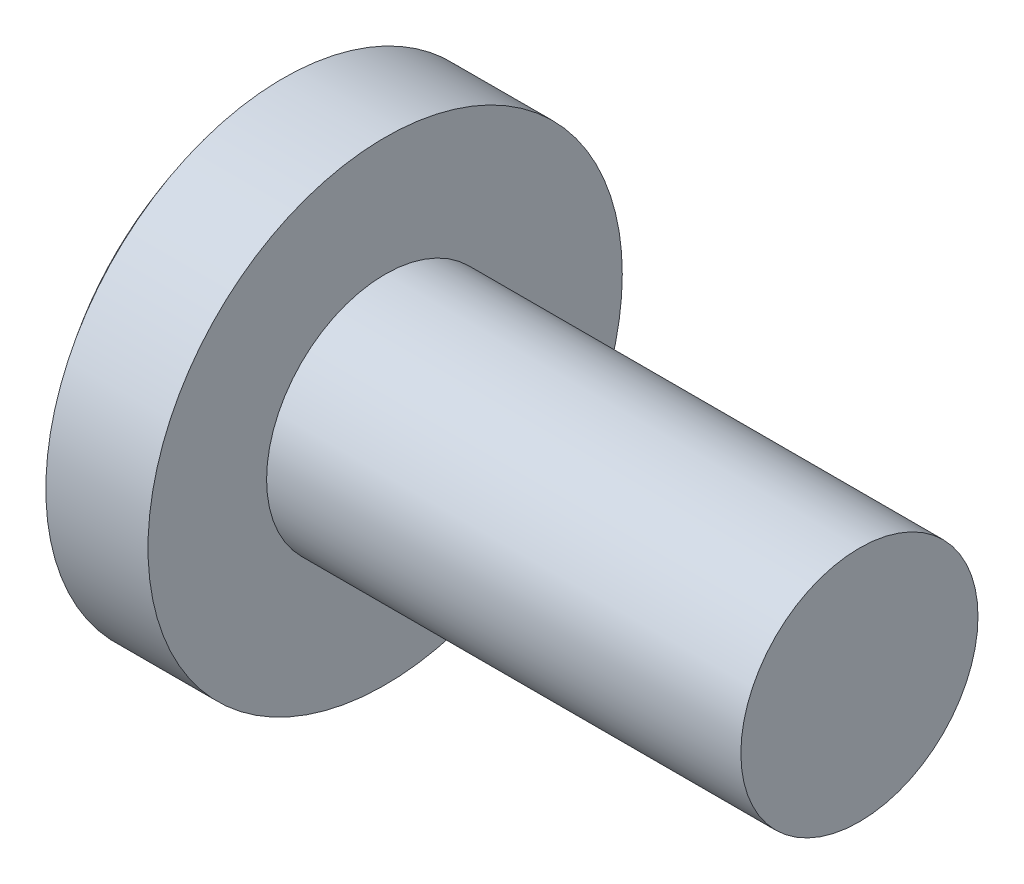
ISO-10303-21;
HEADER;
FILE_DESCRIPTION(('STEP AP214'),'2;1');
FILE_NAME('part.step','',(''),(''),'','','');
FILE_SCHEMA(('AUTOMOTIVE_DESIGN { 1 0 10303 214 1 1 1 1 }'));
ENDSEC;
DATA;
#1=APPLICATION_CONTEXT('core data for automotive mechanical design processes');
#2=APPLICATION_PROTOCOL_DEFINITION('international standard','automotive_design',2000,#1);
#3=PRODUCT_CONTEXT('',#1,'mechanical');
#4=PRODUCT('Part','Part','',(#3));
#5=PRODUCT_RELATED_PRODUCT_CATEGORY('part','',(#4));
#6=PRODUCT_DEFINITION_FORMATION('','',#4);
#7=PRODUCT_DEFINITION_CONTEXT('part definition',#1,'design');
#8=PRODUCT_DEFINITION('design','',#6,#7);
#9=PRODUCT_DEFINITION_SHAPE('','',#8);
#10=(LENGTH_UNIT() NAMED_UNIT(*) SI_UNIT(.MILLI.,.METRE.));
#11=(NAMED_UNIT(*) PLANE_ANGLE_UNIT() SI_UNIT($,.RADIAN.));
#12=(NAMED_UNIT(*) SI_UNIT($,.STERADIAN.) SOLID_ANGLE_UNIT());
#13=UNCERTAINTY_MEASURE_WITH_UNIT(LENGTH_MEASURE(1.E-05),#10,'distance_accuracy_value','');
#14=(GEOMETRIC_REPRESENTATION_CONTEXT(3) GLOBAL_UNCERTAINTY_ASSIGNED_CONTEXT((#13)) GLOBAL_UNIT_ASSIGNED_CONTEXT((#10,
#11,#12)) REPRESENTATION_CONTEXT('',''));
#15=CARTESIAN_POINT('',(0.,0.,0.));
#16=DIRECTION('',(0.,0.,1.));
#17=DIRECTION('',(1.,0.,0.));
#18=AXIS2_PLACEMENT_3D('',#15,#16,#17);
#19=CARTESIAN_POINT('',(6.5,0.,0.));
#20=DIRECTION('',(1.,0.,0.));
#21=DIRECTION('',(0.,1.,0.));
#22=AXIS2_PLACEMENT_3D('',#19,#20,#21);
#23=SPHERICAL_SURFACE('',#22,6.5);
#24=CARTESIAN_POINT('',(1.3765246170202,0.,0.));
#25=DIRECTION('',(1.,0.,0.));
#26=DIRECTION('',(0.,0.,-1.));
#27=AXIS2_PLACEMENT_3D('',#24,#25,#26);
#28=CIRCLE('',#27,4.);
#29=CARTESIAN_POINT('',(1.3765246170202,0.,-4.));
#30=VERTEX_POINT('',#29);
#31=EDGE_CURVE('E154',#30,#30,#28,.T.);
#32=ORIENTED_EDGE('',*,*,#31,.F.);
#33=EDGE_LOOP('',(#32));
#34=FACE_BOUND('',#33,.T.);
#35=CARTESIAN_POINT('',(6.5,-0.44,0.));
#36=DIRECTION('',(0.,1.,0.));
#37=DIRECTION('',(0.,0.,1.));
#38=AXIS2_PLACEMENT_3D('',#35,#36,#37);
#39=CIRCLE('',#38,6.48509059304494);
#40=CARTESIAN_POINT('',(0.333444887912562,-0.440000000000001,2.00748550420378));
#41=VERTEX_POINT('',#40);
#42=CARTESIAN_POINT('',(0.0572676603788668,-0.44,0.74));
#43=VERTEX_POINT('',#42);
#44=EDGE_CURVE('E237',#41,#43,#39,.F.);
#45=ORIENTED_EDGE('',*,*,#44,.T.);
#46=CARTESIAN_POINT('',(0.0572676603788668,-0.44,0.74));
#47=CARTESIAN_POINT('',(0.0553459095034013,-0.439985341253235,0.72328305296714));
#48=CARTESIAN_POINT('',(0.0535867486844832,-0.441396550947806,0.706548480277779));
#49=CARTESIAN_POINT('',(0.0504373840847339,-0.446984059228203,0.673519044256814));
#50=CARTESIAN_POINT('',(0.049047023684214,-0.451159181412456,0.657223996920084));
#51=CARTESIAN_POINT('',(0.0466764207612451,-0.462192225889046,0.625521412589929));
#52=CARTESIAN_POINT('',(0.045696493338291,-0.469052201622536,0.610114565285908));
#53=CARTESIAN_POINT('',(0.0441774835674306,-0.485262357640217,0.580654009149765));
#54=CARTESIAN_POINT('',(0.043638262994652,-0.494611755912349,0.566599877268183));
#55=CARTESIAN_POINT('',(0.0430188919704421,-0.515464220625998,0.540343256526173));
#56=CARTESIAN_POINT('',(0.0429355253534806,-0.526951606000225,0.528128388224687));
#57=CARTESIAN_POINT('',(0.0432217527040635,-0.551797332001338,0.505780157883181));
#58=CARTESIAN_POINT('',(0.0435914161120769,-0.565155959174266,0.49564711522353));
#59=CARTESIAN_POINT('',(0.0447707140747327,-0.593313108529131,0.477778249110346));
#60=CARTESIAN_POINT('',(0.0455789968290601,-0.608107092571906,0.470035174343328));
#61=CARTESIAN_POINT('',(0.0476108904953491,-0.638747141176103,0.457114889529338));
#62=CARTESIAN_POINT('',(0.0488343419884246,-0.65459280003348,0.451936696478722));
#63=CARTESIAN_POINT('',(0.0512407906304824,-0.682094193797786,0.445409618854467));
#64=CARTESIAN_POINT('',(0.0523285977729336,-0.693602036355864,0.443380984422657));
#65=CARTESIAN_POINT('',(0.0546743160010162,-0.716741634082106,0.440676069271593));
#66=CARTESIAN_POINT('',(0.0559319812556667,-0.728373188198784,0.439997856052776));
#67=CARTESIAN_POINT('',(0.057267660378867,-0.74,0.44));
#68=B_SPLINE_CURVE_WITH_KNOTS('',3,(#46,#47,#48,#49,#50,#51,#52,#53,#54,#55,#56,#57,#58,#59,#60,
#61,#62,#63,#64,#65,#66,#67),.UNSPECIFIED.,.F.,.F.,(4,2,2,2,2,2,2,2,2,2,4),(0.,
0.0504198812115462,0.100818316040611,0.151255372379012,0.201676603381452,0.251741636319805,
0.301814344189272,0.351733600037098,0.401633709250622,0.436765534122532,0.471847047898825),.UNSPECIFIED.);
#69=CARTESIAN_POINT('',(0.0572676603788668,-0.74,0.44));
#70=VERTEX_POINT('',#69);
#71=EDGE_CURVE('E240',#43,#70,#68,.T.);
#72=ORIENTED_EDGE('',*,*,#71,.T.);
#73=CARTESIAN_POINT('',(6.5,0.,0.44));
#74=DIRECTION('',(0.,0.,-1.));
#75=DIRECTION('',(0.,1.,0.));
#76=AXIS2_PLACEMENT_3D('',#73,#74,#75);
#77=CIRCLE('',#76,6.48509059304494);
#78=CARTESIAN_POINT('',(0.333444887912563,-2.00748550420378,0.439999999999999));
#79=VERTEX_POINT('',#78);
#80=EDGE_CURVE('E248',#70,#79,#77,.F.);
#81=ORIENTED_EDGE('',*,*,#80,.T.);
#82=CARTESIAN_POINT('',(5.82762794416288,1.16458256229943,0.));
#83=DIRECTION('',(-0.500000000000001,0.866025403784438,0.));
#84=DIRECTION('',(-0.866025403784438,-0.500000000000001,0.));
#85=AXIS2_PLACEMENT_3D('',#82,#83,#84);
#86=CIRCLE('',#85,6.35937601295264);
#87=CARTESIAN_POINT('',(0.333444887912563,-2.00748550420378,-0.44));
#88=VERTEX_POINT('',#87);
#89=EDGE_CURVE('E251',#79,#88,#86,.F.);
#90=ORIENTED_EDGE('',*,*,#89,.T.);
#91=CARTESIAN_POINT('',(6.5,0.,-0.44));
#92=DIRECTION('',(0.,0.,1.));
#93=DIRECTION('',(0.,-1.,0.));
#94=AXIS2_PLACEMENT_3D('',#91,#92,#93);
#95=CIRCLE('',#94,6.48509059304494);
#96=CARTESIAN_POINT('',(0.0572676603788668,-0.74,-0.44));
#97=VERTEX_POINT('',#96);
#98=EDGE_CURVE('E258',#88,#97,#95,.F.);
#99=ORIENTED_EDGE('',*,*,#98,.T.);
#100=CARTESIAN_POINT('',(0.0572676603788668,-0.74,-0.44));
#101=CARTESIAN_POINT('',(0.0553459095034004,-0.72328305296714,-0.439985341253235));
#102=CARTESIAN_POINT('',(0.0535867486844825,-0.706548480277779,-0.441396550947806));
#103=CARTESIAN_POINT('',(0.0504373840847338,-0.673519044256814,-0.446984059228203));
#104=CARTESIAN_POINT('',(0.0490470236842143,-0.657223996920084,-0.451159181412456));
#105=CARTESIAN_POINT('',(0.0466764207612448,-0.625521412589929,-0.462192225889046));
#106=CARTESIAN_POINT('',(0.0456964933382896,-0.610114565285909,-0.469052201622536));
#107=CARTESIAN_POINT('',(0.0441774835674296,-0.580654009149766,-0.485262357640217));
#108=CARTESIAN_POINT('',(0.0436382629946526,-0.566599877268183,-0.49461175591235));
#109=CARTESIAN_POINT('',(0.0430188919704431,-0.540343256526173,-0.515464220625998));
#110=CARTESIAN_POINT('',(0.0429355253534805,-0.528128388224687,-0.526951606000225));
#111=CARTESIAN_POINT('',(0.0432217527040627,-0.505780157883181,-0.551797332001338));
#112=CARTESIAN_POINT('',(0.0435914161120766,-0.49564711522353,-0.565155959174266));
#113=CARTESIAN_POINT('',(0.0447707140747329,-0.477778249110346,-0.593313108529131));
#114=CARTESIAN_POINT('',(0.0455789968290602,-0.470035174343328,-0.608107092571906));
#115=CARTESIAN_POINT('',(0.0476108904953489,-0.457114889529338,-0.638747141176103));
#116=CARTESIAN_POINT('',(0.0488343419884243,-0.451936696478722,-0.65459280003348));
#117=CARTESIAN_POINT('',(0.0512407906304825,-0.445409618854467,-0.682094193797787));
#118=CARTESIAN_POINT('',(0.0523285977729342,-0.443380984422657,-0.693602036355865));
#119=CARTESIAN_POINT('',(0.0546743160010168,-0.440676069271593,-0.716741634082106));
#120=CARTESIAN_POINT('',(0.055931981255667,-0.439997856052776,-0.728373188198785));
#121=CARTESIAN_POINT('',(0.057267660378866,-0.44,-0.74));
#122=B_SPLINE_CURVE_WITH_KNOTS('',3,(#100,#101,#102,#103,#104,#105,#106,#107,#108,#109,#110,
#111,#112,#113,#114,#115,#116,#117,#118,#119,#120,#121),.UNSPECIFIED.,.F.,.F.,(4,2,2,2,2,2,2,2,
2,2,4),(0.,0.0504198812115463,0.100818316040611,0.151255372379012,0.201676603381452,
0.251741636319806,0.301814344189272,0.351733600037098,0.401633709250623,0.436765534122532,
0.471847047898826),.UNSPECIFIED.);
#123=CARTESIAN_POINT('',(0.0572676603788668,-0.44,-0.74));
#124=VERTEX_POINT('',#123);
#125=EDGE_CURVE('E295',#97,#124,#122,.T.);
#126=ORIENTED_EDGE('',*,*,#125,.T.);
#127=CARTESIAN_POINT('',(6.5,-0.44,0.));
#128=DIRECTION('',(0.,1.,0.));
#129=DIRECTION('',(0.,0.,1.));
#130=AXIS2_PLACEMENT_3D('',#127,#128,#129);
#131=CIRCLE('',#130,6.48509059304494);
#132=CARTESIAN_POINT('',(0.333444887912563,-0.44,-2.00748550420378));
#133=VERTEX_POINT('',#132);
#134=EDGE_CURVE('E256',#124,#133,#131,.F.);
#135=ORIENTED_EDGE('',*,*,#134,.T.);
#136=CARTESIAN_POINT('',(5.82762794416288,0.,1.16458256229943));
#137=DIRECTION('',(-0.500000000000001,0.,0.866025403784438));
#138=DIRECTION('',(0.866025403784438,0.,0.500000000000001));
#139=AXIS2_PLACEMENT_3D('',#136,#137,#138);
#140=CIRCLE('',#139,6.35937601295264);
#141=CARTESIAN_POINT('',(0.333444887912563,0.44,-2.00748550420378));
#142=VERTEX_POINT('',#141);
#143=EDGE_CURVE('E132',#133,#142,#140,.F.);
#144=ORIENTED_EDGE('',*,*,#143,.T.);
#145=CARTESIAN_POINT('',(6.5,0.44,0.));
#146=DIRECTION('',(0.,-1.,0.));
#147=DIRECTION('',(0.,0.,-1.));
#148=AXIS2_PLACEMENT_3D('',#145,#146,#147);
#149=CIRCLE('',#148,6.48509059304494);
#150=CARTESIAN_POINT('',(0.0572676603788668,0.44,-0.74));
#151=VERTEX_POINT('',#150);
#152=EDGE_CURVE('E259',#142,#151,#149,.F.);
#153=ORIENTED_EDGE('',*,*,#152,.T.);
#154=CARTESIAN_POINT('',(0.0572676603788668,0.44,-0.74));
#155=CARTESIAN_POINT('',(0.0553459095034022,0.439985341253234,-0.72328305296714));
#156=CARTESIAN_POINT('',(0.0535867486844841,0.441396550947806,-0.706548480277779));
#157=CARTESIAN_POINT('',(0.050437384084734,0.446984059228202,-0.673519044256814));
#158=CARTESIAN_POINT('',(0.0490470236842134,0.451159181412456,-0.657223996920085));
#159=CARTESIAN_POINT('',(0.0466764207612439,0.462192225889046,-0.625521412589929));
#160=CARTESIAN_POINT('',(0.0456964933382898,0.469052201622536,-0.610114565285909));
#161=CARTESIAN_POINT('',(0.0441774835674304,0.485262357640217,-0.580654009149766));
#162=CARTESIAN_POINT('',(0.0436382629946528,0.494611755912349,-0.566599877268183));
#163=CARTESIAN_POINT('',(0.0430188919704429,0.515464220625998,-0.540343256526173));
#164=CARTESIAN_POINT('',(0.0429355253534805,0.526951606000225,-0.528128388224688));
#165=CARTESIAN_POINT('',(0.0432217527040629,0.551797332001338,-0.505780157883181));
#166=CARTESIAN_POINT('',(0.0435914161120767,0.565155959174266,-0.49564711522353));
#167=CARTESIAN_POINT('',(0.0447707140747328,0.593313108529131,-0.477778249110346));
#168=CARTESIAN_POINT('',(0.0455789968290601,0.608107092571906,-0.470035174343329));
#169=CARTESIAN_POINT('',(0.0476108904953489,0.638747141176103,-0.457114889529339));
#170=CARTESIAN_POINT('',(0.0488343419884243,0.65459280003348,-0.451936696478722));
#171=CARTESIAN_POINT('',(0.0512407906304825,0.682094193797786,-0.445409618854468));
#172=CARTESIAN_POINT('',(0.0523285977729342,0.693602036355864,-0.443380984422657));
#173=CARTESIAN_POINT('',(0.0546743160010168,0.716741634082106,-0.440676069271593));
#174=CARTESIAN_POINT('',(0.055931981255667,0.728373188198784,-0.439997856052776));
#175=CARTESIAN_POINT('',(0.057267660378866,0.74,-0.44));
#176=B_SPLINE_CURVE_WITH_KNOTS('',3,(#154,#155,#156,#157,#158,#159,#160,#161,#162,#163,#164,
#165,#166,#167,#168,#169,#170,#171,#172,#173,#174,#175),.UNSPECIFIED.,.F.,.F.,(4,2,2,2,2,2,2,2,
2,2,4),(0.,0.0504198812115463,0.100818316040611,0.151255372379012,0.201676603381452,
0.251741636319806,0.301814344189272,0.351733600037099,0.401633709250623,0.436765534122532,
0.471847047898825),.UNSPECIFIED.);
#177=CARTESIAN_POINT('',(0.0572676603788668,0.74,-0.44));
#178=VERTEX_POINT('',#177);
#179=EDGE_CURVE('E172',#151,#178,#176,.T.);
#180=ORIENTED_EDGE('',*,*,#179,.T.);
#181=CARTESIAN_POINT('',(6.5,0.,-0.44));
#182=DIRECTION('',(0.,0.,1.));
#183=DIRECTION('',(0.,-1.,0.));
#184=AXIS2_PLACEMENT_3D('',#181,#182,#183);
#185=CIRCLE('',#184,6.48509059304494);
#186=CARTESIAN_POINT('',(0.333444887912562,2.00748550420378,-0.44));
#187=VERTEX_POINT('',#186);
#188=EDGE_CURVE('E262',#178,#187,#185,.F.);
#189=ORIENTED_EDGE('',*,*,#188,.T.);
#190=CARTESIAN_POINT('',(5.82762794416288,-1.16458256229943,0.));
#191=DIRECTION('',(-0.500000000000001,-0.866025403784438,0.));
#192=DIRECTION('',(0.866025403784438,-0.500000000000001,0.));
#193=AXIS2_PLACEMENT_3D('',#190,#191,#192);
#194=CIRCLE('',#193,6.35937601295264);
#195=CARTESIAN_POINT('',(0.333444887912563,2.00748550420378,0.44));
#196=VERTEX_POINT('',#195);
#197=EDGE_CURVE('E277',#187,#196,#194,.F.);
#198=ORIENTED_EDGE('',*,*,#197,.T.);
#199=CARTESIAN_POINT('',(6.5,0.,0.44));
#200=DIRECTION('',(0.,0.,-1.));
#201=DIRECTION('',(0.,1.,0.));
#202=AXIS2_PLACEMENT_3D('',#199,#200,#201);
#203=CIRCLE('',#202,6.48509059304494);
#204=CARTESIAN_POINT('',(0.0572676603788668,0.74,0.44));
#205=VERTEX_POINT('',#204);
#206=EDGE_CURVE('E168',#196,#205,#203,.F.);
#207=ORIENTED_EDGE('',*,*,#206,.T.);
#208=CARTESIAN_POINT('',(0.0572676603788668,0.74,0.44));
#209=CARTESIAN_POINT('',(0.0553459095034025,0.72328305296714,0.439985341253235));
#210=CARTESIAN_POINT('',(0.0535867486844845,0.706548480277779,0.441396550947806));
#211=CARTESIAN_POINT('',(0.0504373840847344,0.673519044256814,0.446984059228202));
#212=CARTESIAN_POINT('',(0.0490470236842137,0.657223996920084,0.451159181412456));
#213=CARTESIAN_POINT('',(0.0466764207612437,0.625521412589929,0.462192225889046));
#214=CARTESIAN_POINT('',(0.0456964933382894,0.610114565285909,0.469052201622536));
#215=CARTESIAN_POINT('',(0.0441774835674296,0.580654009149766,0.485262357640217));
#216=CARTESIAN_POINT('',(0.0436382629946519,0.566599877268183,0.494611755912349));
#217=CARTESIAN_POINT('',(0.0430188919704421,0.540343256526173,0.515464220625998));
#218=CARTESIAN_POINT('',(0.0429355253534799,0.528128388224687,0.526951606000225));
#219=CARTESIAN_POINT('',(0.0432217527040626,0.505780157883181,0.551797332001338));
#220=CARTESIAN_POINT('',(0.0435914161120766,0.49564711522353,0.565155959174266));
#221=CARTESIAN_POINT('',(0.044770714074733,0.477778249110346,0.593313108529131));
#222=CARTESIAN_POINT('',(0.0455789968290603,0.470035174343329,0.608107092571906));
#223=CARTESIAN_POINT('',(0.047610890495349,0.457114889529338,0.638747141176103));
#224=CARTESIAN_POINT('',(0.0488343419884244,0.451936696478722,0.65459280003348));
#225=CARTESIAN_POINT('',(0.0512407906304825,0.445409618854467,0.682094193797786));
#226=CARTESIAN_POINT('',(0.0523285977729341,0.443380984422657,0.693602036355864));
#227=CARTESIAN_POINT('',(0.0546743160010167,0.440676069271593,0.716741634082106));
#228=CARTESIAN_POINT('',(0.055931981255667,0.439997856052776,0.728373188198784));
#229=CARTESIAN_POINT('',(0.0572676603788661,0.44,0.74));
#230=B_SPLINE_CURVE_WITH_KNOTS('',3,(#208,#209,#210,#211,#212,#213,#214,#215,#216,#217,#218,
#219,#220,#221,#222,#223,#224,#225,#226,#227,#228,#229),.UNSPECIFIED.,.F.,.F.,(4,2,2,2,2,2,2,2,
2,2,4),(0.,0.0504198812115462,0.100818316040611,0.151255372379012,0.201676603381452,
0.251741636319806,0.301814344189272,0.351733600037099,0.401633709250623,0.436765534122532,
0.471847047898826),.UNSPECIFIED.);
#231=CARTESIAN_POINT('',(0.0572676603788668,0.44,0.74));
#232=VERTEX_POINT('',#231);
#233=EDGE_CURVE('E182',#205,#232,#230,.T.);
#234=ORIENTED_EDGE('',*,*,#233,.T.);
#235=CARTESIAN_POINT('',(6.5,0.44,0.));
#236=DIRECTION('',(0.,-1.,0.));
#237=DIRECTION('',(0.,0.,-1.));
#238=AXIS2_PLACEMENT_3D('',#235,#236,#237);
#239=CIRCLE('',#238,6.48509059304494);
#240=CARTESIAN_POINT('',(0.333444887912563,0.44,2.00748550420378));
#241=VERTEX_POINT('',#240);
#242=EDGE_CURVE('E173',#232,#241,#239,.F.);
#243=ORIENTED_EDGE('',*,*,#242,.T.);
#244=CARTESIAN_POINT('',(5.82762794416288,0.,-1.16458256229943));
#245=DIRECTION('',(-0.500000000000001,0.,-0.866025403784438));
#246=DIRECTION('',(-0.866025403784438,0.,0.500000000000001));
#247=AXIS2_PLACEMENT_3D('',#244,#245,#246);
#248=CIRCLE('',#247,6.35937601295264);
#249=EDGE_CURVE('E243',#241,#41,#248,.F.);
#250=ORIENTED_EDGE('',*,*,#249,.T.);
#251=EDGE_LOOP('',(#45,#72,#81,#90,#99,#126,#135,#144,#153,#180,#189,#198,#207,#234,#243,#250));
#252=FACE_BOUND('',#251,.T.);
#253=ADVANCED_FACE('F39',(#34,#252),#23,.T.);
#254=CARTESIAN_POINT('',(11.1,2.,0.));
#255=DIRECTION('',(1.,0.,0.));
#256=DIRECTION('',(0.,0.,-1.));
#257=AXIS2_PLACEMENT_3D('',#254,#255,#256);
#258=PLANE('',#257);
#259=CARTESIAN_POINT('',(11.1,0.,0.));
#260=DIRECTION('',(1.,0.,0.));
#261=DIRECTION('',(0.,0.,-1.));
#262=AXIS2_PLACEMENT_3D('',#259,#260,#261);
#263=CIRCLE('',#262,2.);
#264=CARTESIAN_POINT('',(11.1,0.,-2.));
#265=VERTEX_POINT('',#264);
#266=EDGE_CURVE('E165',#265,#265,#263,.T.);
#267=ORIENTED_EDGE('',*,*,#266,.T.);
#268=EDGE_LOOP('',(#267));
#269=FACE_BOUND('',#268,.T.);
#270=ADVANCED_FACE('F223',(#269),#258,.T.);
#271=CARTESIAN_POINT('',(4.51581291088132,0.,0.));
#272=DIRECTION('',(1.,0.,0.));
#273=DIRECTION('',(0.,0.,-1.));
#274=AXIS2_PLACEMENT_3D('',#271,#272,#273);
#275=CYLINDRICAL_SURFACE('',#274,2.);
#276=CARTESIAN_POINT('',(3.1,0.,0.));
#277=DIRECTION('',(1.,0.,0.));
#278=DIRECTION('',(0.,0.,-1.));
#279=AXIS2_PLACEMENT_3D('',#276,#277,#278);
#280=CIRCLE('',#279,2.);
#281=CARTESIAN_POINT('',(3.1,0.,-2.));
#282=VERTEX_POINT('',#281);
#283=EDGE_CURVE('E162',#282,#282,#280,.T.);
#284=ORIENTED_EDGE('',*,*,#283,.T.);
#285=EDGE_LOOP('',(#284));
#286=FACE_BOUND('',#285,.T.);
#287=ORIENTED_EDGE('',*,*,#266,.F.);
#288=EDGE_LOOP('',(#287));
#289=FACE_BOUND('',#288,.T.);
#290=ADVANCED_FACE('F228',(#286,#289),#275,.T.);
#291=CARTESIAN_POINT('',(3.1,2.35,0.));
#292=DIRECTION('',(1.,0.,0.));
#293=DIRECTION('',(0.,0.,-1.));
#294=AXIS2_PLACEMENT_3D('',#291,#292,#293);
#295=PLANE('',#294);
#296=CARTESIAN_POINT('',(3.1,0.,0.));
#297=DIRECTION('',(1.,0.,0.));
#298=DIRECTION('',(0.,0.,-1.));
#299=AXIS2_PLACEMENT_3D('',#296,#297,#298);
#300=CIRCLE('',#299,4.);
#301=CARTESIAN_POINT('',(3.1,0.,-4.));
#302=VERTEX_POINT('',#301);
#303=EDGE_CURVE('E157',#302,#302,#300,.T.);
#304=ORIENTED_EDGE('',*,*,#303,.T.);
#305=EDGE_LOOP('',(#304));
#306=FACE_BOUND('',#305,.T.);
#307=ORIENTED_EDGE('',*,*,#283,.F.);
#308=EDGE_LOOP('',(#307));
#309=FACE_BOUND('',#308,.T.);
#310=ADVANCED_FACE('F365',(#306,#309),#295,.T.);
#311=CARTESIAN_POINT('',(4.51581291088132,0.,0.));
#312=DIRECTION('',(1.,0.,0.));
#313=DIRECTION('',(0.,0.,-1.));
#314=AXIS2_PLACEMENT_3D('',#311,#312,#313);
#315=CYLINDRICAL_SURFACE('',#314,4.);
#316=ORIENTED_EDGE('',*,*,#31,.T.);
#317=EDGE_LOOP('',(#316));
#318=FACE_BOUND('',#317,.T.);
#319=ORIENTED_EDGE('',*,*,#303,.F.);
#320=EDGE_LOOP('',(#319));
#321=FACE_BOUND('',#320,.T.);
#322=ADVANCED_FACE('F219',(#318,#321),#315,.T.);
#323=CARTESIAN_POINT('',(2.17,0.44,0.44));
#324=DIRECTION('',(0.,-1.,0.));
#325=DIRECTION('',(0.,0.,-1.));
#326=AXIS2_PLACEMENT_3D('',#323,#324,#325);
#327=PLANE('',#326);
#328=ORIENTED_EDGE('',*,*,#242,.F.);
#329=DIRECTION('',(-1.,0.,0.));
#330=VECTOR('',#329,1.);
#331=CARTESIAN_POINT('',(2.17,0.44,0.74));
#332=LINE('',#331,#330);
#333=CARTESIAN_POINT('',(2.17,0.44,0.74));
#334=VERTEX_POINT('',#333);
#335=EDGE_CURVE('E307',#232,#334,#332,.F.);
#336=ORIENTED_EDGE('',*,*,#335,.T.);
#337=DIRECTION('',(0.,0.,1.));
#338=VECTOR('',#337,1.);
#339=CARTESIAN_POINT('',(2.17,0.44,0.44));
#340=LINE('',#339,#338);
#341=CARTESIAN_POINT('',(2.17,0.44,0.94714991585851));
#342=VERTEX_POINT('',#341);
#343=EDGE_CURVE('E288',#334,#342,#340,.T.);
#344=ORIENTED_EDGE('',*,*,#343,.T.);
#345=DIRECTION('',(-0.866025403784438,0.,0.500000000000001));
#346=VECTOR('',#345,1.);
#347=CARTESIAN_POINT('',(0.,0.44,2.2));
#348=LINE('',#347,#346);
#349=EDGE_CURVE('E158',#342,#241,#348,.T.);
#350=ORIENTED_EDGE('',*,*,#349,.T.);
#351=EDGE_LOOP('',(#328,#336,#344,#350));
#352=FACE_BOUND('',#351,.T.);
#353=ADVANCED_FACE('F211',(#352),#327,.T.);
#354=CARTESIAN_POINT('',(0.,0.,2.2));
#355=DIRECTION('',(-0.500000000000001,0.,-0.866025403784438));
#356=DIRECTION('',(-0.866025403784438,0.,0.500000000000001));
#357=AXIS2_PLACEMENT_3D('',#354,#355,#356);
#358=PLANE('',#357);
#359=ORIENTED_EDGE('',*,*,#349,.F.);
#360=DIRECTION('',(0.,-1.,0.));
#361=VECTOR('',#360,1.);
#362=CARTESIAN_POINT('',(2.17,0.,0.94714991585851));
#363=LINE('',#362,#361);
#364=CARTESIAN_POINT('',(2.17,-0.44,0.947149915858509));
#365=VERTEX_POINT('',#364);
#366=EDGE_CURVE('E286',#342,#365,#363,.T.);
#367=ORIENTED_EDGE('',*,*,#366,.T.);
#368=DIRECTION('',(-0.866025403784438,0.,0.500000000000001));
#369=VECTOR('',#368,1.);
#370=CARTESIAN_POINT('',(2.38960235533031,-0.44,0.820362436893881));
#371=LINE('',#370,#369);
#372=EDGE_CURVE('E266',#365,#41,#371,.T.);
#373=ORIENTED_EDGE('',*,*,#372,.T.);
#374=ORIENTED_EDGE('',*,*,#249,.F.);
#375=EDGE_LOOP('',(#359,#367,#373,#374));
#376=FACE_BOUND('',#375,.T.);
#377=ADVANCED_FACE('F208',(#376),#358,.T.);
#378=CARTESIAN_POINT('',(2.17,-0.44,0.44));
#379=DIRECTION('',(0.,1.,0.));
#380=DIRECTION('',(0.,0.,1.));
#381=AXIS2_PLACEMENT_3D('',#378,#379,#380);
#382=PLANE('',#381);
#383=DIRECTION('',(0.,0.,-1.));
#384=VECTOR('',#383,1.);
#385=CARTESIAN_POINT('',(2.17,-0.44,0.44));
#386=LINE('',#385,#384);
#387=CARTESIAN_POINT('',(2.17,-0.44,0.74));
#388=VERTEX_POINT('',#387);
#389=EDGE_CURVE('E287',#365,#388,#386,.T.);
#390=ORIENTED_EDGE('',*,*,#389,.T.);
#391=DIRECTION('',(-1.,0.,0.));
#392=VECTOR('',#391,1.);
#393=CARTESIAN_POINT('',(2.17,-0.44,0.74));
#394=LINE('',#393,#392);
#395=EDGE_CURVE('E169',#388,#43,#394,.T.);
#396=ORIENTED_EDGE('',*,*,#395,.T.);
#397=ORIENTED_EDGE('',*,*,#44,.F.);
#398=ORIENTED_EDGE('',*,*,#372,.F.);
#399=EDGE_LOOP('',(#390,#396,#397,#398));
#400=FACE_BOUND('',#399,.T.);
#401=ADVANCED_FACE('F210',(#400),#382,.T.);
#402=CARTESIAN_POINT('',(2.17,-0.44,0.44));
#403=DIRECTION('',(0.,0.,-1.));
#404=DIRECTION('',(0.,1.,0.));
#405=AXIS2_PLACEMENT_3D('',#402,#403,#404);
#406=PLANE('',#405);
#407=ORIENTED_EDGE('',*,*,#80,.F.);
#408=DIRECTION('',(-1.,0.,0.));
#409=VECTOR('',#408,1.);
#410=CARTESIAN_POINT('',(2.17,-0.74,0.44));
#411=LINE('',#410,#409);
#412=CARTESIAN_POINT('',(2.17,-0.74,0.44));
#413=VERTEX_POINT('',#412);
#414=EDGE_CURVE('E309',#70,#413,#411,.F.);
#415=ORIENTED_EDGE('',*,*,#414,.T.);
#416=DIRECTION('',(0.,-1.,0.));
#417=VECTOR('',#416,1.);
#418=CARTESIAN_POINT('',(2.17,-0.44,0.44));
#419=LINE('',#418,#417);
#420=CARTESIAN_POINT('',(2.17,-0.94714991585851,0.44));
#421=VERTEX_POINT('',#420);
#422=EDGE_CURVE('E273',#413,#421,#419,.T.);
#423=ORIENTED_EDGE('',*,*,#422,.T.);
#424=DIRECTION('',(-0.866025403784438,-0.500000000000001,0.));
#425=VECTOR('',#424,1.);
#426=CARTESIAN_POINT('',(0.,-2.2,0.439999999999999));
#427=LINE('',#426,#425);
#428=EDGE_CURVE('E263',#421,#79,#427,.T.);
#429=ORIENTED_EDGE('',*,*,#428,.T.);
#430=EDGE_LOOP('',(#407,#415,#423,#429));
#431=FACE_BOUND('',#430,.T.);
#432=ADVANCED_FACE('F204',(#431),#406,.T.);
#433=CARTESIAN_POINT('',(0.,-2.2,0.));
#434=DIRECTION('',(-0.500000000000001,0.866025403784438,0.));
#435=DIRECTION('',(-0.866025403784438,-0.500000000000001,0.));
#436=AXIS2_PLACEMENT_3D('',#433,#434,#435);
#437=PLANE('',#436);
#438=ORIENTED_EDGE('',*,*,#428,.F.);
#439=DIRECTION('',(0.,0.,-1.));
#440=VECTOR('',#439,1.);
#441=CARTESIAN_POINT('',(2.17,-0.94714991585851,0.));
#442=LINE('',#441,#440);
#443=CARTESIAN_POINT('',(2.17,-0.94714991585851,-0.44));
#444=VERTEX_POINT('',#443);
#445=EDGE_CURVE('E271',#421,#444,#442,.T.);
#446=ORIENTED_EDGE('',*,*,#445,.T.);
#447=DIRECTION('',(-0.866025403784438,-0.500000000000001,0.));
#448=VECTOR('',#447,1.);
#449=CARTESIAN_POINT('',(2.38960235533031,-0.820362436893882,-0.44));
#450=LINE('',#449,#448);
#451=EDGE_CURVE('E133',#444,#88,#450,.T.);
#452=ORIENTED_EDGE('',*,*,#451,.T.);
#453=ORIENTED_EDGE('',*,*,#89,.F.);
#454=EDGE_LOOP('',(#438,#446,#452,#453));
#455=FACE_BOUND('',#454,.T.);
#456=ADVANCED_FACE('F200',(#455),#437,.T.);
#457=CARTESIAN_POINT('',(2.17,-0.44,-0.44));
#458=DIRECTION('',(0.,0.,1.));
#459=DIRECTION('',(0.,-1.,0.));
#460=AXIS2_PLACEMENT_3D('',#457,#458,#459);
#461=PLANE('',#460);
#462=DIRECTION('',(0.,1.,0.));
#463=VECTOR('',#462,1.);
#464=CARTESIAN_POINT('',(2.17,-0.44,-0.44));
#465=LINE('',#464,#463);
#466=CARTESIAN_POINT('',(2.17,-0.74,-0.44));
#467=VERTEX_POINT('',#466);
#468=EDGE_CURVE('E127',#444,#467,#465,.T.);
#469=ORIENTED_EDGE('',*,*,#468,.T.);
#470=DIRECTION('',(-1.,0.,0.));
#471=VECTOR('',#470,1.);
#472=CARTESIAN_POINT('',(2.17,-0.74,-0.44));
#473=LINE('',#472,#471);
#474=EDGE_CURVE('E304',#467,#97,#473,.T.);
#475=ORIENTED_EDGE('',*,*,#474,.T.);
#476=ORIENTED_EDGE('',*,*,#98,.F.);
#477=ORIENTED_EDGE('',*,*,#451,.F.);
#478=EDGE_LOOP('',(#469,#475,#476,#477));
#479=FACE_BOUND('',#478,.T.);
#480=ADVANCED_FACE('F203',(#479),#461,.T.);
#481=CARTESIAN_POINT('',(2.17,-0.44,-0.44));
#482=DIRECTION('',(0.,1.,0.));
#483=DIRECTION('',(0.,0.,1.));
#484=AXIS2_PLACEMENT_3D('',#481,#482,#483);
#485=PLANE('',#484);
#486=ORIENTED_EDGE('',*,*,#134,.F.);
#487=DIRECTION('',(-1.,0.,0.));
#488=VECTOR('',#487,1.);
#489=CARTESIAN_POINT('',(2.17,-0.44,-0.74));
#490=LINE('',#489,#488);
#491=CARTESIAN_POINT('',(2.17,-0.44,-0.74));
#492=VERTEX_POINT('',#491);
#493=EDGE_CURVE('E123',#124,#492,#490,.F.);
#494=ORIENTED_EDGE('',*,*,#493,.T.);
#495=DIRECTION('',(0.,0.,-1.));
#496=VECTOR('',#495,1.);
#497=CARTESIAN_POINT('',(2.17,-0.44,-0.44));
#498=LINE('',#497,#496);
#499=CARTESIAN_POINT('',(2.17,-0.44,-0.94714991585851));
#500=VERTEX_POINT('',#499);
#501=EDGE_CURVE('E117',#492,#500,#498,.T.);
#502=ORIENTED_EDGE('',*,*,#501,.T.);
#503=DIRECTION('',(-0.866025403784438,0.,-0.500000000000001));
#504=VECTOR('',#503,1.);
#505=CARTESIAN_POINT('',(0.,-0.44,-2.2));
#506=LINE('',#505,#504);
#507=EDGE_CURVE('E120',#500,#133,#506,.T.);
#508=ORIENTED_EDGE('',*,*,#507,.T.);
#509=EDGE_LOOP('',(#486,#494,#502,#508));
#510=FACE_BOUND('',#509,.T.);
#511=ADVANCED_FACE('F119',(#510),#485,.T.);
#512=CARTESIAN_POINT('',(0.,0.,-2.2));
#513=DIRECTION('',(-0.500000000000001,0.,0.866025403784438));
#514=DIRECTION('',(0.866025403784438,0.,0.500000000000001));
#515=AXIS2_PLACEMENT_3D('',#512,#513,#514);
#516=PLANE('',#515);
#517=ORIENTED_EDGE('',*,*,#507,.F.);
#518=DIRECTION('',(0.,1.,0.));
#519=VECTOR('',#518,1.);
#520=CARTESIAN_POINT('',(2.17,0.,-0.94714991585851));
#521=LINE('',#520,#519);
#522=CARTESIAN_POINT('',(2.17,0.44,-0.94714991585851));
#523=VERTEX_POINT('',#522);
#524=EDGE_CURVE('E43',#500,#523,#521,.T.);
#525=ORIENTED_EDGE('',*,*,#524,.T.);
#526=DIRECTION('',(-0.866025403784438,0.,-0.500000000000001));
#527=VECTOR('',#526,1.);
#528=CARTESIAN_POINT('',(2.38960235533031,0.44,-0.820362436893882));
#529=LINE('',#528,#527);
#530=EDGE_CURVE('E134',#523,#142,#529,.T.);
#531=ORIENTED_EDGE('',*,*,#530,.T.);
#532=ORIENTED_EDGE('',*,*,#143,.F.);
#533=EDGE_LOOP('',(#517,#525,#531,#532));
#534=FACE_BOUND('',#533,.T.);
#535=ADVANCED_FACE('F130',(#534),#516,.T.);
#536=CARTESIAN_POINT('',(2.17,0.44,-0.44));
#537=DIRECTION('',(0.,-1.,0.));
#538=DIRECTION('',(0.,0.,-1.));
#539=AXIS2_PLACEMENT_3D('',#536,#537,#538);
#540=PLANE('',#539);
#541=DIRECTION('',(0.,0.,1.));
#542=VECTOR('',#541,1.);
#543=CARTESIAN_POINT('',(2.17,0.44,-0.44));
#544=LINE('',#543,#542);
#545=CARTESIAN_POINT('',(2.17,0.44,-0.74));
#546=VERTEX_POINT('',#545);
#547=EDGE_CURVE('E140',#523,#546,#544,.T.);
#548=ORIENTED_EDGE('',*,*,#547,.T.);
#549=DIRECTION('',(-1.,0.,0.));
#550=VECTOR('',#549,1.);
#551=CARTESIAN_POINT('',(2.17,0.44,-0.74));
#552=LINE('',#551,#550);
#553=EDGE_CURVE('E315',#546,#151,#552,.T.);
#554=ORIENTED_EDGE('',*,*,#553,.T.);
#555=ORIENTED_EDGE('',*,*,#152,.F.);
#556=ORIENTED_EDGE('',*,*,#530,.F.);
#557=EDGE_LOOP('',(#548,#554,#555,#556));
#558=FACE_BOUND('',#557,.T.);
#559=ADVANCED_FACE('F207',(#558),#540,.T.);
#560=CARTESIAN_POINT('',(2.17,0.44,-0.44));
#561=DIRECTION('',(0.,0.,1.));
#562=DIRECTION('',(0.,-1.,0.));
#563=AXIS2_PLACEMENT_3D('',#560,#561,#562);
#564=PLANE('',#563);
#565=ORIENTED_EDGE('',*,*,#188,.F.);
#566=DIRECTION('',(-1.,0.,0.));
#567=VECTOR('',#566,1.);
#568=CARTESIAN_POINT('',(2.17,0.74,-0.44));
#569=LINE('',#568,#567);
#570=CARTESIAN_POINT('',(2.17,0.74,-0.44));
#571=VERTEX_POINT('',#570);
#572=EDGE_CURVE('E58',#178,#571,#569,.F.);
#573=ORIENTED_EDGE('',*,*,#572,.T.);
#574=DIRECTION('',(0.,1.,0.));
#575=VECTOR('',#574,1.);
#576=CARTESIAN_POINT('',(2.17,0.44,-0.44));
#577=LINE('',#576,#575);
#578=CARTESIAN_POINT('',(2.17,0.94714991585851,-0.44));
#579=VERTEX_POINT('',#578);
#580=EDGE_CURVE('E141',#571,#579,#577,.T.);
#581=ORIENTED_EDGE('',*,*,#580,.T.);
#582=DIRECTION('',(-0.866025403784438,0.500000000000001,0.));
#583=VECTOR('',#582,1.);
#584=CARTESIAN_POINT('',(0.,2.2,-0.44));
#585=LINE('',#584,#583);
#586=EDGE_CURVE('E274',#579,#187,#585,.T.);
#587=ORIENTED_EDGE('',*,*,#586,.T.);
#588=EDGE_LOOP('',(#565,#573,#581,#587));
#589=FACE_BOUND('',#588,.T.);
#590=ADVANCED_FACE('F446',(#589),#564,.T.);
#591=CARTESIAN_POINT('',(0.,2.2,0.));
#592=DIRECTION('',(-0.500000000000001,-0.866025403784438,0.));
#593=DIRECTION('',(0.866025403784438,-0.500000000000001,0.));
#594=AXIS2_PLACEMENT_3D('',#591,#592,#593);
#595=PLANE('',#594);
#596=ORIENTED_EDGE('',*,*,#586,.F.);
#597=DIRECTION('',(0.,0.,1.));
#598=VECTOR('',#597,1.);
#599=CARTESIAN_POINT('',(2.17,0.94714991585851,0.));
#600=LINE('',#599,#598);
#601=CARTESIAN_POINT('',(2.17,0.94714991585851,0.44));
#602=VERTEX_POINT('',#601);
#603=EDGE_CURVE('E146',#579,#602,#600,.T.);
#604=ORIENTED_EDGE('',*,*,#603,.T.);
#605=DIRECTION('',(-0.866025403784438,0.500000000000001,0.));
#606=VECTOR('',#605,1.);
#607=CARTESIAN_POINT('',(2.38960235533031,0.820362436893882,0.44));
#608=LINE('',#607,#606);
#609=EDGE_CURVE('E153',#602,#196,#608,.T.);
#610=ORIENTED_EDGE('',*,*,#609,.T.);
#611=ORIENTED_EDGE('',*,*,#197,.F.);
#612=EDGE_LOOP('',(#596,#604,#610,#611));
#613=FACE_BOUND('',#612,.T.);
#614=ADVANCED_FACE('F41',(#613),#595,.T.);
#615=CARTESIAN_POINT('',(2.17,0.44,0.44));
#616=DIRECTION('',(0.,0.,-1.));
#617=DIRECTION('',(0.,1.,0.));
#618=AXIS2_PLACEMENT_3D('',#615,#616,#617);
#619=PLANE('',#618);
#620=DIRECTION('',(0.,-1.,0.));
#621=VECTOR('',#620,1.);
#622=CARTESIAN_POINT('',(2.17,0.44,0.44));
#623=LINE('',#622,#621);
#624=CARTESIAN_POINT('',(2.17,0.74,0.44));
#625=VERTEX_POINT('',#624);
#626=EDGE_CURVE('E150',#602,#625,#623,.T.);
#627=ORIENTED_EDGE('',*,*,#626,.T.);
#628=DIRECTION('',(-1.,0.,0.));
#629=VECTOR('',#628,1.);
#630=CARTESIAN_POINT('',(2.17,0.74,0.44));
#631=LINE('',#630,#629);
#632=EDGE_CURVE('E303',#625,#205,#631,.T.);
#633=ORIENTED_EDGE('',*,*,#632,.T.);
#634=ORIENTED_EDGE('',*,*,#206,.F.);
#635=ORIENTED_EDGE('',*,*,#609,.F.);
#636=EDGE_LOOP('',(#627,#633,#634,#635));
#637=FACE_BOUND('',#636,.T.);
#638=ADVANCED_FACE('F334',(#637),#619,.T.);
#639=CARTESIAN_POINT('',(2.17,0.44,0.44));
#640=DIRECTION('',(1.,0.,0.));
#641=DIRECTION('',(0.,0.,-1.));
#642=AXIS2_PLACEMENT_3D('',#639,#640,#641);
#643=PLANE('',#642);
#644=ORIENTED_EDGE('',*,*,#343,.F.);
#645=CARTESIAN_POINT('',(2.17,0.74,0.74));
#646=DIRECTION('',(1.,0.,0.));
#647=DIRECTION('',(0.,0.,-1.));
#648=AXIS2_PLACEMENT_3D('',#645,#646,#647);
#649=CIRCLE('',#648,0.3);
#650=EDGE_CURVE('E49',#334,#625,#649,.T.);
#651=ORIENTED_EDGE('',*,*,#650,.T.);
#652=ORIENTED_EDGE('',*,*,#626,.F.);
#653=ORIENTED_EDGE('',*,*,#603,.F.);
#654=ORIENTED_EDGE('',*,*,#580,.F.);
#655=CARTESIAN_POINT('',(2.17,0.74,-0.74));
#656=DIRECTION('',(1.,0.,0.));
#657=DIRECTION('',(0.,0.,-1.));
#658=AXIS2_PLACEMENT_3D('',#655,#656,#657);
#659=CIRCLE('',#658,0.3);
#660=EDGE_CURVE('E11',#571,#546,#659,.T.);
#661=ORIENTED_EDGE('',*,*,#660,.T.);
#662=ORIENTED_EDGE('',*,*,#547,.F.);
#663=ORIENTED_EDGE('',*,*,#524,.F.);
#664=ORIENTED_EDGE('',*,*,#501,.F.);
#665=CARTESIAN_POINT('',(2.17,-0.74,-0.74));
#666=DIRECTION('',(1.,0.,0.));
#667=DIRECTION('',(0.,0.,-1.));
#668=AXIS2_PLACEMENT_3D('',#665,#666,#667);
#669=CIRCLE('',#668,0.3);
#670=EDGE_CURVE('E302',#492,#467,#669,.T.);
#671=ORIENTED_EDGE('',*,*,#670,.T.);
#672=ORIENTED_EDGE('',*,*,#468,.F.);
#673=ORIENTED_EDGE('',*,*,#445,.F.);
#674=ORIENTED_EDGE('',*,*,#422,.F.);
#675=CARTESIAN_POINT('',(2.17,-0.74,0.74));
#676=DIRECTION('',(1.,0.,0.));
#677=DIRECTION('',(0.,0.,-1.));
#678=AXIS2_PLACEMENT_3D('',#675,#676,#677);
#679=CIRCLE('',#678,0.3);
#680=EDGE_CURVE('E318',#413,#388,#679,.T.);
#681=ORIENTED_EDGE('',*,*,#680,.T.);
#682=ORIENTED_EDGE('',*,*,#389,.F.);
#683=ORIENTED_EDGE('',*,*,#366,.F.);
#684=EDGE_LOOP('',(#644,#651,#652,#653,#654,#661,#662,#663,#664,#671,#672,#673,#674,#681,#682,#683));
#685=FACE_BOUND('',#684,.T.);
#686=ADVANCED_FACE('F138',(#685),#643,.F.);
#687=CARTESIAN_POINT('',(2.17,-0.74,0.74));
#688=DIRECTION('',(-1.,0.,0.));
#689=DIRECTION('',(0.,0.,1.));
#690=AXIS2_PLACEMENT_3D('',#687,#688,#689);
#691=CYLINDRICAL_SURFACE('',#690,0.3);
#692=ORIENTED_EDGE('',*,*,#680,.F.);
#693=ORIENTED_EDGE('',*,*,#414,.F.);
#694=ORIENTED_EDGE('',*,*,#71,.F.);
#695=ORIENTED_EDGE('',*,*,#395,.F.);
#696=EDGE_LOOP('',(#692,#693,#694,#695));
#697=FACE_BOUND('',#696,.T.);
#698=ADVANCED_FACE('F358',(#697),#691,.T.);
#699=CARTESIAN_POINT('',(2.17,-0.74,-0.74));
#700=DIRECTION('',(-1.,0.,0.));
#701=DIRECTION('',(0.,0.,1.));
#702=AXIS2_PLACEMENT_3D('',#699,#700,#701);
#703=CYLINDRICAL_SURFACE('',#702,0.3);
#704=ORIENTED_EDGE('',*,*,#670,.F.);
#705=ORIENTED_EDGE('',*,*,#493,.F.);
#706=ORIENTED_EDGE('',*,*,#125,.F.);
#707=ORIENTED_EDGE('',*,*,#474,.F.);
#708=EDGE_LOOP('',(#704,#705,#706,#707));
#709=FACE_BOUND('',#708,.T.);
#710=ADVANCED_FACE('F299',(#709),#703,.T.);
#711=CARTESIAN_POINT('',(2.17,0.74,0.74));
#712=DIRECTION('',(-1.,0.,0.));
#713=DIRECTION('',(0.,0.,1.));
#714=AXIS2_PLACEMENT_3D('',#711,#712,#713);
#715=CYLINDRICAL_SURFACE('',#714,0.3);
#716=ORIENTED_EDGE('',*,*,#650,.F.);
#717=ORIENTED_EDGE('',*,*,#335,.F.);
#718=ORIENTED_EDGE('',*,*,#233,.F.);
#719=ORIENTED_EDGE('',*,*,#632,.F.);
#720=EDGE_LOOP('',(#716,#717,#718,#719));
#721=FACE_BOUND('',#720,.T.);
#722=ADVANCED_FACE('F196',(#721),#715,.T.);
#723=CARTESIAN_POINT('',(2.17,0.74,-0.74));
#724=DIRECTION('',(-1.,0.,0.));
#725=DIRECTION('',(0.,0.,1.));
#726=AXIS2_PLACEMENT_3D('',#723,#724,#725);
#727=CYLINDRICAL_SURFACE('',#726,0.3);
#728=ORIENTED_EDGE('',*,*,#660,.F.);
#729=ORIENTED_EDGE('',*,*,#572,.F.);
#730=ORIENTED_EDGE('',*,*,#179,.F.);
#731=ORIENTED_EDGE('',*,*,#553,.F.);
#732=EDGE_LOOP('',(#728,#729,#730,#731));
#733=FACE_BOUND('',#732,.T.);
#734=ADVANCED_FACE('F192',(#733),#727,.T.);
#735=CLOSED_SHELL('',(#253,#270,#290,#310,#322,#353,#377,#401,#432,#456,#480,#511,#535,#559,
#590,#614,#638,#686,#698,#710,#722,#734));
#736=MANIFOLD_SOLID_BREP('B2',#735);
#737=ADVANCED_BREP_SHAPE_REPRESENTATION('',(#18,#736),#14);
#738=SHAPE_DEFINITION_REPRESENTATION(#9,#737);
ENDSEC;
END-ISO-10303-21;
